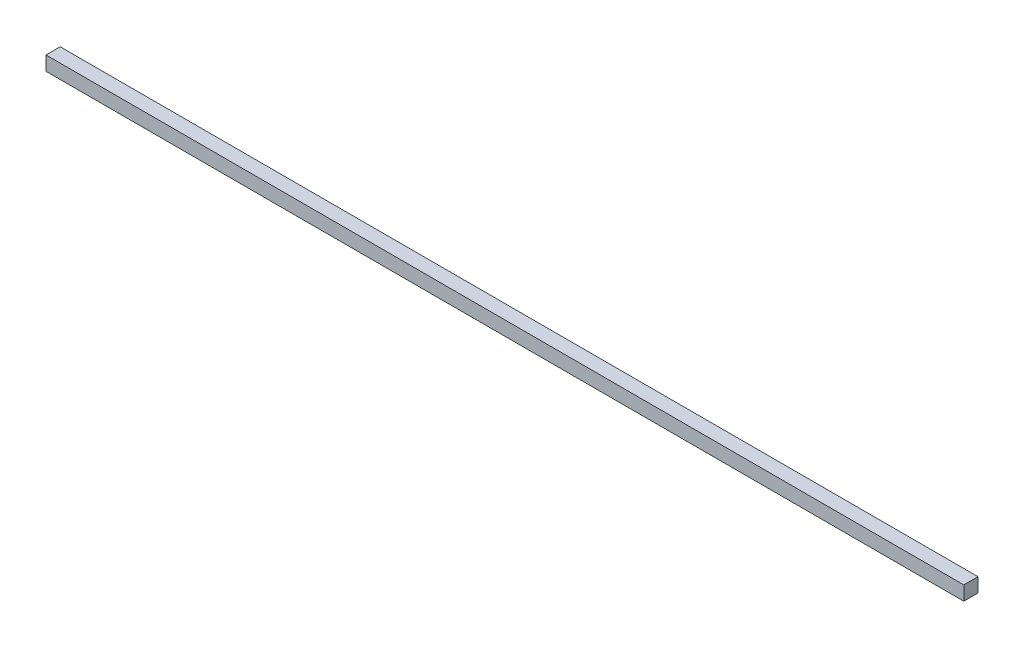
ISO-10303-21;
HEADER;
FILE_DESCRIPTION(('STEP AP214'),'2;1');
FILE_NAME('part.step','',(''),(''),'','','');
FILE_SCHEMA(('AUTOMOTIVE_DESIGN { 1 0 10303 214 1 1 1 1 }'));
ENDSEC;
DATA;
#1=APPLICATION_CONTEXT('core data for automotive mechanical design processes');
#2=APPLICATION_PROTOCOL_DEFINITION('international standard','automotive_design',2000,#1);
#3=PRODUCT_CONTEXT('',#1,'mechanical');
#4=PRODUCT('Part','Part','',(#3));
#5=PRODUCT_RELATED_PRODUCT_CATEGORY('part','',(#4));
#6=PRODUCT_DEFINITION_FORMATION('','',#4);
#7=PRODUCT_DEFINITION_CONTEXT('part definition',#1,'design');
#8=PRODUCT_DEFINITION('design','',#6,#7);
#9=PRODUCT_DEFINITION_SHAPE('','',#8);
#10=(LENGTH_UNIT() NAMED_UNIT(*) SI_UNIT(.MILLI.,.METRE.));
#11=(NAMED_UNIT(*) PLANE_ANGLE_UNIT() SI_UNIT($,.RADIAN.));
#12=(NAMED_UNIT(*) SI_UNIT($,.STERADIAN.) SOLID_ANGLE_UNIT());
#13=UNCERTAINTY_MEASURE_WITH_UNIT(LENGTH_MEASURE(1.E-05),#10,'distance_accuracy_value','');
#14=(GEOMETRIC_REPRESENTATION_CONTEXT(3) GLOBAL_UNCERTAINTY_ASSIGNED_CONTEXT((#13)) GLOBAL_UNIT_ASSIGNED_CONTEXT((#10,
#11,#12)) REPRESENTATION_CONTEXT('',''));
#15=CARTESIAN_POINT('',(0.,0.,0.));
#16=DIRECTION('',(0.,0.,1.));
#17=DIRECTION('',(1.,0.,0.));
#18=AXIS2_PLACEMENT_3D('',#15,#16,#17);
#19=CARTESIAN_POINT('',(0.,0.,15.));
#20=DIRECTION('',(1.,0.,0.));
#21=DIRECTION('',(0.,0.,-1.));
#22=AXIS2_PLACEMENT_3D('',#19,#20,#21);
#23=PLANE('',#22);
#24=DIRECTION('',(0.,-1.,0.));
#25=VECTOR('',#24,1.);
#26=CARTESIAN_POINT('',(0.,0.,0.));
#27=LINE('',#26,#25);
#28=CARTESIAN_POINT('',(0.,15.,0.));
#29=VERTEX_POINT('',#28);
#30=CARTESIAN_POINT('',(0.,0.,0.));
#31=VERTEX_POINT('',#30);
#32=EDGE_CURVE('E106',#29,#31,#27,.T.);
#33=ORIENTED_EDGE('',*,*,#32,.T.);
#34=DIRECTION('',(0.,0.,-1.));
#35=VECTOR('',#34,1.);
#36=CARTESIAN_POINT('',(0.,0.,15.));
#37=LINE('',#36,#35);
#38=CARTESIAN_POINT('',(0.,0.,15.));
#39=VERTEX_POINT('',#38);
#40=EDGE_CURVE('E11',#39,#31,#37,.T.);
#41=ORIENTED_EDGE('',*,*,#40,.F.);
#42=DIRECTION('',(0.,-1.,0.));
#43=VECTOR('',#42,1.);
#44=CARTESIAN_POINT('',(0.,0.,15.));
#45=LINE('',#44,#43);
#46=CARTESIAN_POINT('',(0.,15.,15.));
#47=VERTEX_POINT('',#46);
#48=EDGE_CURVE('E96',#47,#39,#45,.T.);
#49=ORIENTED_EDGE('',*,*,#48,.F.);
#50=DIRECTION('',(0.,0.,-1.));
#51=VECTOR('',#50,1.);
#52=CARTESIAN_POINT('',(0.,15.,15.));
#53=LINE('',#52,#51);
#54=EDGE_CURVE('E101',#47,#29,#53,.T.);
#55=ORIENTED_EDGE('',*,*,#54,.T.);
#56=EDGE_LOOP('',(#33,#41,#49,#55));
#57=FACE_BOUND('',#56,.T.);
#58=ADVANCED_FACE('F44',(#57),#23,.F.);
#59=CARTESIAN_POINT('',(0.,0.,15.));
#60=DIRECTION('',(0.,1.,0.));
#61=DIRECTION('',(0.,0.,1.));
#62=AXIS2_PLACEMENT_3D('',#59,#60,#61);
#63=PLANE('',#62);
#64=DIRECTION('',(1.,0.,0.));
#65=VECTOR('',#64,1.);
#66=CARTESIAN_POINT('',(0.,0.,0.));
#67=LINE('',#66,#65);
#68=CARTESIAN_POINT('',(970.,0.,0.));
#69=VERTEX_POINT('',#68);
#70=EDGE_CURVE('E99',#31,#69,#67,.T.);
#71=ORIENTED_EDGE('',*,*,#70,.T.);
#72=DIRECTION('',(0.,0.,-1.));
#73=VECTOR('',#72,1.);
#74=CARTESIAN_POINT('',(970.,0.,15.));
#75=LINE('',#74,#73);
#76=CARTESIAN_POINT('',(970.,0.,15.));
#77=VERTEX_POINT('',#76);
#78=EDGE_CURVE('E52',#77,#69,#75,.T.);
#79=ORIENTED_EDGE('',*,*,#78,.F.);
#80=DIRECTION('',(1.,0.,0.));
#81=VECTOR('',#80,1.);
#82=CARTESIAN_POINT('',(0.,0.,15.));
#83=LINE('',#82,#81);
#84=EDGE_CURVE('E91',#39,#77,#83,.T.);
#85=ORIENTED_EDGE('',*,*,#84,.F.);
#86=ORIENTED_EDGE('',*,*,#40,.T.);
#87=EDGE_LOOP('',(#71,#79,#85,#86));
#88=FACE_BOUND('',#87,.T.);
#89=ADVANCED_FACE('F98',(#88),#63,.F.);
#90=CARTESIAN_POINT('',(970.,0.,15.));
#91=DIRECTION('',(-1.,0.,0.));
#92=DIRECTION('',(0.,0.,1.));
#93=AXIS2_PLACEMENT_3D('',#90,#91,#92);
#94=PLANE('',#93);
#95=DIRECTION('',(0.,1.,0.));
#96=VECTOR('',#95,1.);
#97=CARTESIAN_POINT('',(970.,0.,0.));
#98=LINE('',#97,#96);
#99=CARTESIAN_POINT('',(970.,15.,0.));
#100=VERTEX_POINT('',#99);
#101=EDGE_CURVE('E76',#69,#100,#98,.T.);
#102=ORIENTED_EDGE('',*,*,#101,.T.);
#103=DIRECTION('',(0.,0.,-1.));
#104=VECTOR('',#103,1.);
#105=CARTESIAN_POINT('',(970.,15.,15.));
#106=LINE('',#105,#104);
#107=CARTESIAN_POINT('',(970.,15.,15.));
#108=VERTEX_POINT('',#107);
#109=EDGE_CURVE('E102',#108,#100,#106,.T.);
#110=ORIENTED_EDGE('',*,*,#109,.F.);
#111=DIRECTION('',(0.,1.,0.));
#112=VECTOR('',#111,1.);
#113=CARTESIAN_POINT('',(970.,0.,15.));
#114=LINE('',#113,#112);
#115=EDGE_CURVE('E92',#77,#108,#114,.T.);
#116=ORIENTED_EDGE('',*,*,#115,.F.);
#117=ORIENTED_EDGE('',*,*,#78,.T.);
#118=EDGE_LOOP('',(#102,#110,#116,#117));
#119=FACE_BOUND('',#118,.T.);
#120=ADVANCED_FACE('F105',(#119),#94,.F.);
#121=CARTESIAN_POINT('',(0.,15.,15.));
#122=DIRECTION('',(0.,-1.,0.));
#123=DIRECTION('',(0.,0.,-1.));
#124=AXIS2_PLACEMENT_3D('',#121,#122,#123);
#125=PLANE('',#124);
#126=DIRECTION('',(-1.,0.,0.));
#127=VECTOR('',#126,1.);
#128=CARTESIAN_POINT('',(0.,15.,0.));
#129=LINE('',#128,#127);
#130=EDGE_CURVE('E84',#100,#29,#129,.T.);
#131=ORIENTED_EDGE('',*,*,#130,.T.);
#132=ORIENTED_EDGE('',*,*,#54,.F.);
#133=DIRECTION('',(-1.,0.,0.));
#134=VECTOR('',#133,1.);
#135=CARTESIAN_POINT('',(0.,15.,15.));
#136=LINE('',#135,#134);
#137=EDGE_CURVE('E63',#108,#47,#136,.T.);
#138=ORIENTED_EDGE('',*,*,#137,.F.);
#139=ORIENTED_EDGE('',*,*,#109,.T.);
#140=EDGE_LOOP('',(#131,#132,#138,#139));
#141=FACE_BOUND('',#140,.T.);
#142=ADVANCED_FACE('F113',(#141),#125,.F.);
#143=CARTESIAN_POINT('',(0.,0.,15.));
#144=DIRECTION('',(0.,0.,-1.));
#145=DIRECTION('',(-1.,0.,0.));
#146=AXIS2_PLACEMENT_3D('',#143,#144,#145);
#147=PLANE('',#146);
#148=ORIENTED_EDGE('',*,*,#48,.T.);
#149=ORIENTED_EDGE('',*,*,#84,.T.);
#150=ORIENTED_EDGE('',*,*,#115,.T.);
#151=ORIENTED_EDGE('',*,*,#137,.T.);
#152=EDGE_LOOP('',(#148,#149,#150,#151));
#153=FACE_BOUND('',#152,.T.);
#154=ADVANCED_FACE('F95',(#153),#147,.F.);
#155=CARTESIAN_POINT('',(0.,0.,0.));
#156=DIRECTION('',(0.,0.,-1.));
#157=DIRECTION('',(-1.,0.,0.));
#158=AXIS2_PLACEMENT_3D('',#155,#156,#157);
#159=PLANE('',#158);
#160=ORIENTED_EDGE('',*,*,#32,.F.);
#161=ORIENTED_EDGE('',*,*,#130,.F.);
#162=ORIENTED_EDGE('',*,*,#101,.F.);
#163=ORIENTED_EDGE('',*,*,#70,.F.);
#164=EDGE_LOOP('',(#160,#161,#162,#163));
#165=FACE_BOUND('',#164,.T.);
#166=ADVANCED_FACE('F116',(#165),#159,.T.);
#167=CLOSED_SHELL('',(#58,#89,#120,#142,#154,#166));
#168=MANIFOLD_SOLID_BREP('B2',#167);
#169=ADVANCED_BREP_SHAPE_REPRESENTATION('',(#18,#168),#14);
#170=SHAPE_DEFINITION_REPRESENTATION(#9,#169);
ENDSEC;
END-ISO-10303-21;
